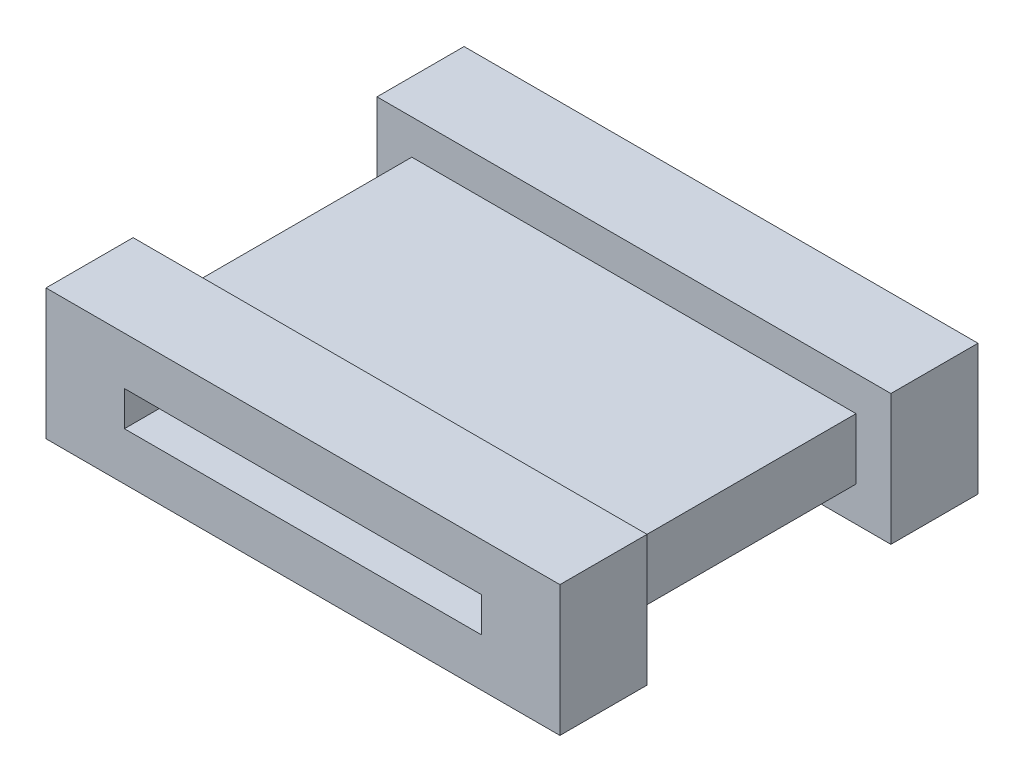
ISO-10303-21;
HEADER;
FILE_DESCRIPTION(('STEP AP214'),'2;1');
FILE_NAME('part.step','',(''),(''),'','','');
FILE_SCHEMA(('AUTOMOTIVE_DESIGN { 1 0 10303 214 1 1 1 1 }'));
ENDSEC;
DATA;
#1=APPLICATION_CONTEXT('core data for automotive mechanical design processes');
#2=APPLICATION_PROTOCOL_DEFINITION('international standard','automotive_design',2000,#1);
#3=PRODUCT_CONTEXT('',#1,'mechanical');
#4=PRODUCT('Part','Part','',(#3));
#5=PRODUCT_RELATED_PRODUCT_CATEGORY('part','',(#4));
#6=PRODUCT_DEFINITION_FORMATION('','',#4);
#7=PRODUCT_DEFINITION_CONTEXT('part definition',#1,'design');
#8=PRODUCT_DEFINITION('design','',#6,#7);
#9=PRODUCT_DEFINITION_SHAPE('','',#8);
#10=(LENGTH_UNIT() NAMED_UNIT(*) SI_UNIT(.MILLI.,.METRE.));
#11=(NAMED_UNIT(*) PLANE_ANGLE_UNIT() SI_UNIT($,.RADIAN.));
#12=(NAMED_UNIT(*) SI_UNIT($,.STERADIAN.) SOLID_ANGLE_UNIT());
#13=UNCERTAINTY_MEASURE_WITH_UNIT(LENGTH_MEASURE(1.E-05),#10,'distance_accuracy_value','');
#14=(GEOMETRIC_REPRESENTATION_CONTEXT(3) GLOBAL_UNCERTAINTY_ASSIGNED_CONTEXT((#13)) GLOBAL_UNIT_ASSIGNED_CONTEXT((#10,
#11,#12)) REPRESENTATION_CONTEXT('',''));
#15=CARTESIAN_POINT('',(0.,0.,0.));
#16=DIRECTION('',(0.,0.,1.));
#17=DIRECTION('',(1.,0.,0.));
#18=AXIS2_PLACEMENT_3D('',#15,#16,#17);
#19=CARTESIAN_POINT('',(29.5,-7.5,-24.));
#20=DIRECTION('',(0.,-1.,0.));
#21=DIRECTION('',(0.,0.,-1.));
#22=AXIS2_PLACEMENT_3D('',#19,#20,#21);
#23=PLANE('',#22);
#24=DIRECTION('',(0.,0.,-1.));
#25=VECTOR('',#24,1.);
#26=CARTESIAN_POINT('',(29.5,-7.5,24.));
#27=LINE('',#26,#25);
#28=CARTESIAN_POINT('',(29.5,-7.5,-14.));
#29=VERTEX_POINT('',#28);
#30=CARTESIAN_POINT('',(29.5,-7.5,-24.));
#31=VERTEX_POINT('',#30);
#32=EDGE_CURVE('E242',#29,#31,#27,.T.);
#33=ORIENTED_EDGE('',*,*,#32,.F.);
#34=DIRECTION('',(-1.,0.,0.));
#35=VECTOR('',#34,1.);
#36=CARTESIAN_POINT('',(-25.5,-7.5,-14.));
#37=LINE('',#36,#35);
#38=CARTESIAN_POINT('',(-29.5,-7.5,-14.));
#39=VERTEX_POINT('',#38);
#40=EDGE_CURVE('E171',#29,#39,#37,.T.);
#41=ORIENTED_EDGE('',*,*,#40,.T.);
#42=DIRECTION('',(0.,0.,1.));
#43=VECTOR('',#42,1.);
#44=CARTESIAN_POINT('',(-29.5,-7.5,24.));
#45=LINE('',#44,#43);
#46=CARTESIAN_POINT('',(-29.5,-7.5,-24.));
#47=VERTEX_POINT('',#46);
#48=EDGE_CURVE('E250',#47,#39,#45,.T.);
#49=ORIENTED_EDGE('',*,*,#48,.F.);
#50=DIRECTION('',(-1.,0.,0.));
#51=VECTOR('',#50,1.);
#52=CARTESIAN_POINT('',(-29.5,-7.5,-24.));
#53=LINE('',#52,#51);
#54=EDGE_CURVE('E246',#31,#47,#53,.T.);
#55=ORIENTED_EDGE('',*,*,#54,.F.);
#56=EDGE_LOOP('',(#33,#41,#49,#55));
#57=FACE_BOUND('',#56,.T.);
#58=ADVANCED_FACE('F31',(#57),#23,.T.);
#59=DIRECTION('',(-1.,0.,0.));
#60=VECTOR('',#59,1.);
#61=CARTESIAN_POINT('',(-25.5,-7.5,14.));
#62=LINE('',#61,#60);
#63=CARTESIAN_POINT('',(29.5,-7.5,14.));
#64=VERTEX_POINT('',#63);
#65=CARTESIAN_POINT('',(-29.5,-7.5,14.));
#66=VERTEX_POINT('',#65);
#67=EDGE_CURVE('E172',#64,#66,#62,.T.);
#68=ORIENTED_EDGE('',*,*,#67,.F.);
#69=CARTESIAN_POINT('',(29.5,-7.5,24.));
#70=VERTEX_POINT('',#69);
#71=EDGE_CURVE('E243',#70,#64,#27,.T.);
#72=ORIENTED_EDGE('',*,*,#71,.F.);
#73=DIRECTION('',(1.,0.,0.));
#74=VECTOR('',#73,1.);
#75=CARTESIAN_POINT('',(-29.5,-7.5,24.));
#76=LINE('',#75,#74);
#77=CARTESIAN_POINT('',(-29.5,-7.5,24.));
#78=VERTEX_POINT('',#77);
#79=EDGE_CURVE('E253',#78,#70,#76,.T.);
#80=ORIENTED_EDGE('',*,*,#79,.F.);
#81=EDGE_CURVE('E249',#66,#78,#45,.T.);
#82=ORIENTED_EDGE('',*,*,#81,.F.);
#83=EDGE_LOOP('',(#68,#72,#80,#82));
#84=FACE_BOUND('',#83,.T.);
#85=ADVANCED_FACE('F281',(#84),#23,.T.);
#86=CARTESIAN_POINT('',(-25.5,-7.5,-14.));
#87=DIRECTION('',(-1.,0.,0.));
#88=DIRECTION('',(0.,0.,1.));
#89=AXIS2_PLACEMENT_3D('',#86,#87,#88);
#90=PLANE('',#89);
#91=DIRECTION('',(0.,-1.,0.));
#92=VECTOR('',#91,1.);
#93=CARTESIAN_POINT('',(-25.5,3.5,-14.));
#94=LINE('',#93,#92);
#95=CARTESIAN_POINT('',(-25.5,3.5,-14.));
#96=VERTEX_POINT('',#95);
#97=CARTESIAN_POINT('',(-25.5,-3.5,-14.));
#98=VERTEX_POINT('',#97);
#99=EDGE_CURVE('E157',#96,#98,#94,.T.);
#100=ORIENTED_EDGE('',*,*,#99,.T.);
#101=DIRECTION('',(0.,0.,1.));
#102=VECTOR('',#101,1.);
#103=CARTESIAN_POINT('',(-25.5,-3.5,-14.));
#104=LINE('',#103,#102);
#105=CARTESIAN_POINT('',(-25.5,-3.5,14.));
#106=VERTEX_POINT('',#105);
#107=EDGE_CURVE('E143',#98,#106,#104,.T.);
#108=ORIENTED_EDGE('',*,*,#107,.T.);
#109=DIRECTION('',(0.,1.,0.));
#110=VECTOR('',#109,1.);
#111=CARTESIAN_POINT('',(-25.5,3.5,14.));
#112=LINE('',#111,#110);
#113=CARTESIAN_POINT('',(-25.5,3.5,14.));
#114=VERTEX_POINT('',#113);
#115=EDGE_CURVE('E163',#106,#114,#112,.T.);
#116=ORIENTED_EDGE('',*,*,#115,.T.);
#117=DIRECTION('',(0.,0.,-1.));
#118=VECTOR('',#117,1.);
#119=CARTESIAN_POINT('',(-25.5,3.5,-14.));
#120=LINE('',#119,#118);
#121=EDGE_CURVE('E162',#114,#96,#120,.T.);
#122=ORIENTED_EDGE('',*,*,#121,.T.);
#123=EDGE_LOOP('',(#100,#108,#116,#122));
#124=FACE_BOUND('',#123,.T.);
#125=ADVANCED_FACE('F160',(#124),#90,.T.);
#126=CARTESIAN_POINT('',(25.5,-7.5,-14.));
#127=DIRECTION('',(1.,0.,0.));
#128=DIRECTION('',(0.,0.,1.));
#129=AXIS2_PLACEMENT_3D('',#126,#127,#128);
#130=PLANE('',#129);
#131=DIRECTION('',(0.,1.,0.));
#132=VECTOR('',#131,1.);
#133=CARTESIAN_POINT('',(25.5,3.5,14.));
#134=LINE('',#133,#132);
#135=CARTESIAN_POINT('',(25.5,-3.5,14.));
#136=VERTEX_POINT('',#135);
#137=CARTESIAN_POINT('',(25.5,3.5,14.));
#138=VERTEX_POINT('',#137);
#139=EDGE_CURVE('E53',#136,#138,#134,.T.);
#140=ORIENTED_EDGE('',*,*,#139,.F.);
#141=DIRECTION('',(0.,0.,-1.));
#142=VECTOR('',#141,1.);
#143=CARTESIAN_POINT('',(25.5,-3.5,-14.));
#144=LINE('',#143,#142);
#145=CARTESIAN_POINT('',(25.5,-3.5,-14.));
#146=VERTEX_POINT('',#145);
#147=EDGE_CURVE('E11',#136,#146,#144,.T.);
#148=ORIENTED_EDGE('',*,*,#147,.T.);
#149=DIRECTION('',(0.,-1.,0.));
#150=VECTOR('',#149,1.);
#151=CARTESIAN_POINT('',(25.5,3.5,-14.));
#152=LINE('',#151,#150);
#153=CARTESIAN_POINT('',(25.5,3.5,-14.));
#154=VERTEX_POINT('',#153);
#155=EDGE_CURVE('E149',#154,#146,#152,.T.);
#156=ORIENTED_EDGE('',*,*,#155,.F.);
#157=DIRECTION('',(0.,0.,-1.));
#158=VECTOR('',#157,1.);
#159=CARTESIAN_POINT('',(25.5,3.5,-14.));
#160=LINE('',#159,#158);
#161=EDGE_CURVE('E166',#138,#154,#160,.T.);
#162=ORIENTED_EDGE('',*,*,#161,.F.);
#163=EDGE_LOOP('',(#140,#148,#156,#162));
#164=FACE_BOUND('',#163,.T.);
#165=ADVANCED_FACE('F406',(#164),#130,.T.);
#166=CARTESIAN_POINT('',(-29.5,3.5,-14.));
#167=DIRECTION('',(0.,1.,0.));
#168=DIRECTION('',(0.,0.,1.));
#169=AXIS2_PLACEMENT_3D('',#166,#167,#168);
#170=PLANE('',#169);
#171=DIRECTION('',(1.,0.,0.));
#172=VECTOR('',#171,1.);
#173=CARTESIAN_POINT('',(-29.5,3.5,14.));
#174=LINE('',#173,#172);
#175=EDGE_CURVE('E180',#114,#138,#174,.T.);
#176=ORIENTED_EDGE('',*,*,#175,.T.);
#177=ORIENTED_EDGE('',*,*,#161,.T.);
#178=DIRECTION('',(-1.,0.,0.));
#179=VECTOR('',#178,1.);
#180=CARTESIAN_POINT('',(29.5,3.5,-14.));
#181=LINE('',#180,#179);
#182=EDGE_CURVE('E178',#154,#96,#181,.T.);
#183=ORIENTED_EDGE('',*,*,#182,.T.);
#184=ORIENTED_EDGE('',*,*,#121,.F.);
#185=EDGE_LOOP('',(#176,#177,#183,#184));
#186=FACE_BOUND('',#185,.T.);
#187=ADVANCED_FACE('F343',(#186),#170,.T.);
#188=CARTESIAN_POINT('',(29.5,-7.5,24.));
#189=DIRECTION('',(1.,0.,0.));
#190=DIRECTION('',(0.,0.,-1.));
#191=AXIS2_PLACEMENT_3D('',#188,#189,#190);
#192=PLANE('',#191);
#193=DIRECTION('',(0.,1.,0.));
#194=VECTOR('',#193,1.);
#195=CARTESIAN_POINT('',(29.5,3.5,-14.));
#196=LINE('',#195,#194);
#197=CARTESIAN_POINT('',(29.5,7.5,-14.));
#198=VERTEX_POINT('',#197);
#199=EDGE_CURVE('E189',#29,#198,#196,.T.);
#200=ORIENTED_EDGE('',*,*,#199,.F.);
#201=ORIENTED_EDGE('',*,*,#32,.T.);
#202=DIRECTION('',(0.,1.,0.));
#203=VECTOR('',#202,1.);
#204=CARTESIAN_POINT('',(29.5,-7.5,-24.));
#205=LINE('',#204,#203);
#206=CARTESIAN_POINT('',(29.5,7.5,-24.));
#207=VERTEX_POINT('',#206);
#208=EDGE_CURVE('E256',#31,#207,#205,.T.);
#209=ORIENTED_EDGE('',*,*,#208,.T.);
#210=DIRECTION('',(0.,0.,-1.));
#211=VECTOR('',#210,1.);
#212=CARTESIAN_POINT('',(29.5,7.5,24.));
#213=LINE('',#212,#211);
#214=EDGE_CURVE('E222',#198,#207,#213,.T.);
#215=ORIENTED_EDGE('',*,*,#214,.F.);
#216=EDGE_LOOP('',(#200,#201,#209,#215));
#217=FACE_BOUND('',#216,.T.);
#218=ADVANCED_FACE('F33',(#217),#192,.T.);
#219=ORIENTED_EDGE('',*,*,#71,.T.);
#220=DIRECTION('',(0.,1.,0.));
#221=VECTOR('',#220,1.);
#222=CARTESIAN_POINT('',(29.5,3.5,14.));
#223=LINE('',#222,#221);
#224=CARTESIAN_POINT('',(29.5,7.5,14.));
#225=VERTEX_POINT('',#224);
#226=EDGE_CURVE('E192',#64,#225,#223,.T.);
#227=ORIENTED_EDGE('',*,*,#226,.T.);
#228=CARTESIAN_POINT('',(29.5,7.5,24.));
#229=VERTEX_POINT('',#228);
#230=EDGE_CURVE('E229',#229,#225,#213,.T.);
#231=ORIENTED_EDGE('',*,*,#230,.F.);
#232=DIRECTION('',(0.,1.,0.));
#233=VECTOR('',#232,1.);
#234=CARTESIAN_POINT('',(29.5,-7.5,24.));
#235=LINE('',#234,#233);
#236=EDGE_CURVE('E39',#70,#229,#235,.T.);
#237=ORIENTED_EDGE('',*,*,#236,.F.);
#238=EDGE_LOOP('',(#219,#227,#231,#237));
#239=FACE_BOUND('',#238,.T.);
#240=ADVANCED_FACE('F329',(#239),#192,.T.);
#241=CARTESIAN_POINT('',(-29.5,-7.5,24.));
#242=DIRECTION('',(-1.,0.,0.));
#243=DIRECTION('',(0.,0.,1.));
#244=AXIS2_PLACEMENT_3D('',#241,#242,#243);
#245=PLANE('',#244);
#246=ORIENTED_EDGE('',*,*,#48,.T.);
#247=DIRECTION('',(0.,1.,0.));
#248=VECTOR('',#247,1.);
#249=CARTESIAN_POINT('',(-29.5,3.5,-14.));
#250=LINE('',#249,#248);
#251=CARTESIAN_POINT('',(-29.5,7.5,-14.));
#252=VERTEX_POINT('',#251);
#253=EDGE_CURVE('E184',#39,#252,#250,.T.);
#254=ORIENTED_EDGE('',*,*,#253,.T.);
#255=DIRECTION('',(0.,0.,1.));
#256=VECTOR('',#255,1.);
#257=CARTESIAN_POINT('',(-29.5,7.5,24.));
#258=LINE('',#257,#256);
#259=CARTESIAN_POINT('',(-29.5,7.5,-24.));
#260=VERTEX_POINT('',#259);
#261=EDGE_CURVE('E236',#260,#252,#258,.T.);
#262=ORIENTED_EDGE('',*,*,#261,.F.);
#263=DIRECTION('',(0.,1.,0.));
#264=VECTOR('',#263,1.);
#265=CARTESIAN_POINT('',(-29.5,-7.5,-24.));
#266=LINE('',#265,#264);
#267=EDGE_CURVE('E261',#47,#260,#266,.T.);
#268=ORIENTED_EDGE('',*,*,#267,.F.);
#269=EDGE_LOOP('',(#246,#254,#262,#268));
#270=FACE_BOUND('',#269,.T.);
#271=ADVANCED_FACE('F277',(#270),#245,.T.);
#272=CARTESIAN_POINT('',(29.5,7.5,-24.));
#273=DIRECTION('',(0.,-1.,0.));
#274=DIRECTION('',(0.,0.,-1.));
#275=AXIS2_PLACEMENT_3D('',#272,#273,#274);
#276=PLANE('',#275);
#277=ORIENTED_EDGE('',*,*,#261,.T.);
#278=DIRECTION('',(-1.,0.,0.));
#279=VECTOR('',#278,1.);
#280=CARTESIAN_POINT('',(29.5,7.5,-14.));
#281=LINE('',#280,#279);
#282=EDGE_CURVE('E175',#198,#252,#281,.T.);
#283=ORIENTED_EDGE('',*,*,#282,.F.);
#284=ORIENTED_EDGE('',*,*,#214,.T.);
#285=DIRECTION('',(-1.,0.,0.));
#286=VECTOR('',#285,1.);
#287=CARTESIAN_POINT('',(-29.5,7.5,-24.));
#288=LINE('',#287,#286);
#289=EDGE_CURVE('E232',#207,#260,#288,.T.);
#290=ORIENTED_EDGE('',*,*,#289,.T.);
#291=EDGE_LOOP('',(#277,#283,#284,#290));
#292=FACE_BOUND('',#291,.T.);
#293=ADVANCED_FACE('F274',(#292),#276,.F.);
#294=CARTESIAN_POINT('',(-29.5,-7.5,24.));
#295=DIRECTION('',(0.,0.,1.));
#296=DIRECTION('',(1.,0.,0.));
#297=AXIS2_PLACEMENT_3D('',#294,#295,#296);
#298=PLANE('',#297);
#299=DIRECTION('',(0.,1.,0.));
#300=VECTOR('',#299,1.);
#301=CARTESIAN_POINT('',(20.5,2.,24.));
#302=LINE('',#301,#300);
#303=CARTESIAN_POINT('',(20.5,-2.,24.));
#304=VERTEX_POINT('',#303);
#305=CARTESIAN_POINT('',(20.5,2.,24.));
#306=VERTEX_POINT('',#305);
#307=EDGE_CURVE('E191',#304,#306,#302,.T.);
#308=ORIENTED_EDGE('',*,*,#307,.F.);
#309=DIRECTION('',(1.,0.,0.));
#310=VECTOR('',#309,1.);
#311=CARTESIAN_POINT('',(-20.5,-2.,24.));
#312=LINE('',#311,#310);
#313=CARTESIAN_POINT('',(-20.5,-2.,24.));
#314=VERTEX_POINT('',#313);
#315=EDGE_CURVE('E201',#314,#304,#312,.T.);
#316=ORIENTED_EDGE('',*,*,#315,.F.);
#317=DIRECTION('',(0.,-1.,0.));
#318=VECTOR('',#317,1.);
#319=CARTESIAN_POINT('',(-20.5,2.,24.));
#320=LINE('',#319,#318);
#321=CARTESIAN_POINT('',(-20.5,2.,24.));
#322=VERTEX_POINT('',#321);
#323=EDGE_CURVE('E215',#322,#314,#320,.T.);
#324=ORIENTED_EDGE('',*,*,#323,.F.);
#325=DIRECTION('',(-1.,0.,0.));
#326=VECTOR('',#325,1.);
#327=CARTESIAN_POINT('',(-20.5,2.,24.));
#328=LINE('',#327,#326);
#329=EDGE_CURVE('E212',#306,#322,#328,.T.);
#330=ORIENTED_EDGE('',*,*,#329,.F.);
#331=EDGE_LOOP('',(#308,#316,#324,#330));
#332=FACE_BOUND('',#331,.T.);
#333=ORIENTED_EDGE('',*,*,#236,.T.);
#334=DIRECTION('',(1.,0.,0.));
#335=VECTOR('',#334,1.);
#336=CARTESIAN_POINT('',(-29.5,7.5,24.));
#337=LINE('',#336,#335);
#338=CARTESIAN_POINT('',(-29.5,7.5,24.));
#339=VERTEX_POINT('',#338);
#340=EDGE_CURVE('E239',#339,#229,#337,.T.);
#341=ORIENTED_EDGE('',*,*,#340,.F.);
#342=DIRECTION('',(0.,1.,0.));
#343=VECTOR('',#342,1.);
#344=CARTESIAN_POINT('',(-29.5,-7.5,24.));
#345=LINE('',#344,#343);
#346=EDGE_CURVE('E258',#78,#339,#345,.T.);
#347=ORIENTED_EDGE('',*,*,#346,.F.);
#348=ORIENTED_EDGE('',*,*,#79,.T.);
#349=EDGE_LOOP('',(#333,#341,#347,#348));
#350=FACE_BOUND('',#349,.T.);
#351=ADVANCED_FACE('F291',(#332,#350),#298,.T.);
#352=DIRECTION('',(0.,1.,0.));
#353=VECTOR('',#352,1.);
#354=CARTESIAN_POINT('',(-29.5,3.5,14.));
#355=LINE('',#354,#353);
#356=CARTESIAN_POINT('',(-29.5,7.5,14.));
#357=VERTEX_POINT('',#356);
#358=EDGE_CURVE('E194',#66,#357,#355,.T.);
#359=ORIENTED_EDGE('',*,*,#358,.F.);
#360=ORIENTED_EDGE('',*,*,#81,.T.);
#361=ORIENTED_EDGE('',*,*,#346,.T.);
#362=EDGE_CURVE('E235',#357,#339,#258,.T.);
#363=ORIENTED_EDGE('',*,*,#362,.F.);
#364=EDGE_LOOP('',(#359,#360,#361,#363));
#365=FACE_BOUND('',#364,.T.);
#366=ADVANCED_FACE('F294',(#365),#245,.T.);
#367=CARTESIAN_POINT('',(-29.5,-7.5,-24.));
#368=DIRECTION('',(0.,0.,-1.));
#369=DIRECTION('',(-1.,0.,0.));
#370=AXIS2_PLACEMENT_3D('',#367,#368,#369);
#371=PLANE('',#370);
#372=DIRECTION('',(0.,1.,0.));
#373=VECTOR('',#372,1.);
#374=CARTESIAN_POINT('',(20.5,2.,-24.));
#375=LINE('',#374,#373);
#376=CARTESIAN_POINT('',(20.5,-2.,-24.));
#377=VERTEX_POINT('',#376);
#378=CARTESIAN_POINT('',(20.5,2.,-24.));
#379=VERTEX_POINT('',#378);
#380=EDGE_CURVE('E197',#377,#379,#375,.T.);
#381=ORIENTED_EDGE('',*,*,#380,.T.);
#382=DIRECTION('',(-1.,0.,0.));
#383=VECTOR('',#382,1.);
#384=CARTESIAN_POINT('',(-20.5,2.,-24.));
#385=LINE('',#384,#383);
#386=CARTESIAN_POINT('',(-20.5,2.,-24.));
#387=VERTEX_POINT('',#386);
#388=EDGE_CURVE('E200',#379,#387,#385,.T.);
#389=ORIENTED_EDGE('',*,*,#388,.T.);
#390=DIRECTION('',(0.,-1.,0.));
#391=VECTOR('',#390,1.);
#392=CARTESIAN_POINT('',(-20.5,2.,-24.));
#393=LINE('',#392,#391);
#394=CARTESIAN_POINT('',(-20.5,-2.,-24.));
#395=VERTEX_POINT('',#394);
#396=EDGE_CURVE('E204',#387,#395,#393,.T.);
#397=ORIENTED_EDGE('',*,*,#396,.T.);
#398=DIRECTION('',(1.,0.,0.));
#399=VECTOR('',#398,1.);
#400=CARTESIAN_POINT('',(-20.5,-2.,-24.));
#401=LINE('',#400,#399);
#402=EDGE_CURVE('E207',#395,#377,#401,.T.);
#403=ORIENTED_EDGE('',*,*,#402,.T.);
#404=EDGE_LOOP('',(#381,#389,#397,#403));
#405=FACE_BOUND('',#404,.T.);
#406=ORIENTED_EDGE('',*,*,#267,.T.);
#407=ORIENTED_EDGE('',*,*,#289,.F.);
#408=ORIENTED_EDGE('',*,*,#208,.F.);
#409=ORIENTED_EDGE('',*,*,#54,.T.);
#410=EDGE_LOOP('',(#406,#407,#408,#409));
#411=FACE_BOUND('',#410,.T.);
#412=ADVANCED_FACE('F271',(#405,#411),#371,.T.);
#413=ORIENTED_EDGE('',*,*,#230,.T.);
#414=DIRECTION('',(1.,0.,0.));
#415=VECTOR('',#414,1.);
#416=CARTESIAN_POINT('',(-29.5,7.5,14.));
#417=LINE('',#416,#415);
#418=EDGE_CURVE('E181',#357,#225,#417,.T.);
#419=ORIENTED_EDGE('',*,*,#418,.F.);
#420=ORIENTED_EDGE('',*,*,#362,.T.);
#421=ORIENTED_EDGE('',*,*,#340,.T.);
#422=EDGE_LOOP('',(#413,#419,#420,#421));
#423=FACE_BOUND('',#422,.T.);
#424=ADVANCED_FACE('F289',(#423),#276,.F.);
#425=CARTESIAN_POINT('',(20.5,2.,-24.));
#426=DIRECTION('',(1.,0.,0.));
#427=DIRECTION('',(0.,0.,-1.));
#428=AXIS2_PLACEMENT_3D('',#425,#426,#427);
#429=PLANE('',#428);
#430=ORIENTED_EDGE('',*,*,#307,.T.);
#431=DIRECTION('',(0.,0.,1.));
#432=VECTOR('',#431,1.);
#433=CARTESIAN_POINT('',(20.5,2.,-24.));
#434=LINE('',#433,#432);
#435=EDGE_CURVE('E210',#379,#306,#434,.T.);
#436=ORIENTED_EDGE('',*,*,#435,.F.);
#437=ORIENTED_EDGE('',*,*,#380,.F.);
#438=DIRECTION('',(0.,0.,1.));
#439=VECTOR('',#438,1.);
#440=CARTESIAN_POINT('',(20.5,-2.,-24.));
#441=LINE('',#440,#439);
#442=EDGE_CURVE('E220',#377,#304,#441,.T.);
#443=ORIENTED_EDGE('',*,*,#442,.T.);
#444=EDGE_LOOP('',(#430,#436,#437,#443));
#445=FACE_BOUND('',#444,.T.);
#446=ADVANCED_FACE('F303',(#445),#429,.F.);
#447=CARTESIAN_POINT('',(-20.5,-2.,-24.));
#448=DIRECTION('',(0.,-1.,0.));
#449=DIRECTION('',(0.,0.,-1.));
#450=AXIS2_PLACEMENT_3D('',#447,#448,#449);
#451=PLANE('',#450);
#452=ORIENTED_EDGE('',*,*,#315,.T.);
#453=ORIENTED_EDGE('',*,*,#442,.F.);
#454=ORIENTED_EDGE('',*,*,#402,.F.);
#455=DIRECTION('',(0.,0.,1.));
#456=VECTOR('',#455,1.);
#457=CARTESIAN_POINT('',(-20.5,-2.,-24.));
#458=LINE('',#457,#456);
#459=EDGE_CURVE('E223',#395,#314,#458,.T.);
#460=ORIENTED_EDGE('',*,*,#459,.T.);
#461=EDGE_LOOP('',(#452,#453,#454,#460));
#462=FACE_BOUND('',#461,.T.);
#463=ADVANCED_FACE('F319',(#462),#451,.F.);
#464=CARTESIAN_POINT('',(-20.5,2.,-24.));
#465=DIRECTION('',(-1.,0.,0.));
#466=DIRECTION('',(0.,0.,1.));
#467=AXIS2_PLACEMENT_3D('',#464,#465,#466);
#468=PLANE('',#467);
#469=ORIENTED_EDGE('',*,*,#323,.T.);
#470=ORIENTED_EDGE('',*,*,#459,.F.);
#471=ORIENTED_EDGE('',*,*,#396,.F.);
#472=DIRECTION('',(0.,0.,1.));
#473=VECTOR('',#472,1.);
#474=CARTESIAN_POINT('',(-20.5,2.,-24.));
#475=LINE('',#474,#473);
#476=EDGE_CURVE('E225',#387,#322,#475,.T.);
#477=ORIENTED_EDGE('',*,*,#476,.T.);
#478=EDGE_LOOP('',(#469,#470,#471,#477));
#479=FACE_BOUND('',#478,.T.);
#480=ADVANCED_FACE('F316',(#479),#468,.F.);
#481=CARTESIAN_POINT('',(-20.5,2.,-24.));
#482=DIRECTION('',(0.,1.,0.));
#483=DIRECTION('',(-1.,0.,0.));
#484=AXIS2_PLACEMENT_3D('',#481,#482,#483);
#485=PLANE('',#484);
#486=ORIENTED_EDGE('',*,*,#329,.T.);
#487=ORIENTED_EDGE('',*,*,#476,.F.);
#488=ORIENTED_EDGE('',*,*,#388,.F.);
#489=ORIENTED_EDGE('',*,*,#435,.T.);
#490=EDGE_LOOP('',(#486,#487,#488,#489));
#491=FACE_BOUND('',#490,.T.);
#492=ADVANCED_FACE('F313',(#491),#485,.F.);
#493=CARTESIAN_POINT('',(29.5,3.5,-14.));
#494=DIRECTION('',(0.,0.,-1.));
#495=DIRECTION('',(-1.,0.,0.));
#496=AXIS2_PLACEMENT_3D('',#493,#494,#495);
#497=PLANE('',#496);
#498=ORIENTED_EDGE('',*,*,#155,.T.);
#499=DIRECTION('',(-1.,0.,0.));
#500=VECTOR('',#499,1.);
#501=CARTESIAN_POINT('',(29.5,-3.5,-14.));
#502=LINE('',#501,#500);
#503=EDGE_CURVE('E46',#146,#98,#502,.T.);
#504=ORIENTED_EDGE('',*,*,#503,.T.);
#505=ORIENTED_EDGE('',*,*,#99,.F.);
#506=ORIENTED_EDGE('',*,*,#182,.F.);
#507=EDGE_LOOP('',(#498,#504,#505,#506));
#508=FACE_BOUND('',#507,.T.);
#509=ORIENTED_EDGE('',*,*,#40,.F.);
#510=ORIENTED_EDGE('',*,*,#199,.T.);
#511=ORIENTED_EDGE('',*,*,#282,.T.);
#512=ORIENTED_EDGE('',*,*,#253,.F.);
#513=EDGE_LOOP('',(#509,#510,#511,#512));
#514=FACE_BOUND('',#513,.T.);
#515=ADVANCED_FACE('F154',(#508,#514),#497,.F.);
#516=CARTESIAN_POINT('',(-29.5,3.5,14.));
#517=DIRECTION('',(0.,0.,1.));
#518=DIRECTION('',(1.,0.,0.));
#519=AXIS2_PLACEMENT_3D('',#516,#517,#518);
#520=PLANE('',#519);
#521=ORIENTED_EDGE('',*,*,#115,.F.);
#522=DIRECTION('',(1.,0.,0.));
#523=VECTOR('',#522,1.);
#524=CARTESIAN_POINT('',(-29.5,-3.5,14.));
#525=LINE('',#524,#523);
#526=EDGE_CURVE('E145',#106,#136,#525,.T.);
#527=ORIENTED_EDGE('',*,*,#526,.T.);
#528=ORIENTED_EDGE('',*,*,#139,.T.);
#529=ORIENTED_EDGE('',*,*,#175,.F.);
#530=EDGE_LOOP('',(#521,#527,#528,#529));
#531=FACE_BOUND('',#530,.T.);
#532=ORIENTED_EDGE('',*,*,#226,.F.);
#533=ORIENTED_EDGE('',*,*,#67,.T.);
#534=ORIENTED_EDGE('',*,*,#358,.T.);
#535=ORIENTED_EDGE('',*,*,#418,.T.);
#536=EDGE_LOOP('',(#532,#533,#534,#535));
#537=FACE_BOUND('',#536,.T.);
#538=ADVANCED_FACE('F332',(#531,#537),#520,.F.);
#539=CARTESIAN_POINT('',(-29.5,-3.5,-14.));
#540=DIRECTION('',(0.,-1.,0.));
#541=DIRECTION('',(0.,0.,1.));
#542=AXIS2_PLACEMENT_3D('',#539,#540,#541);
#543=PLANE('',#542);
#544=ORIENTED_EDGE('',*,*,#503,.F.);
#545=ORIENTED_EDGE('',*,*,#147,.F.);
#546=ORIENTED_EDGE('',*,*,#526,.F.);
#547=ORIENTED_EDGE('',*,*,#107,.F.);
#548=EDGE_LOOP('',(#544,#545,#546,#547));
#549=FACE_BOUND('',#548,.T.);
#550=ADVANCED_FACE('F144',(#549),#543,.T.);
#551=CLOSED_SHELL('',(#58,#85,#125,#165,#187,#218,#240,#271,#293,#351,#366,#412,#424,#446,#463,
#480,#492,#515,#538,#550));
#552=MANIFOLD_SOLID_BREP('B2',#551);
#553=ADVANCED_BREP_SHAPE_REPRESENTATION('',(#18,#552),#14);
#554=SHAPE_DEFINITION_REPRESENTATION(#9,#553);
ENDSEC;
END-ISO-10303-21;
